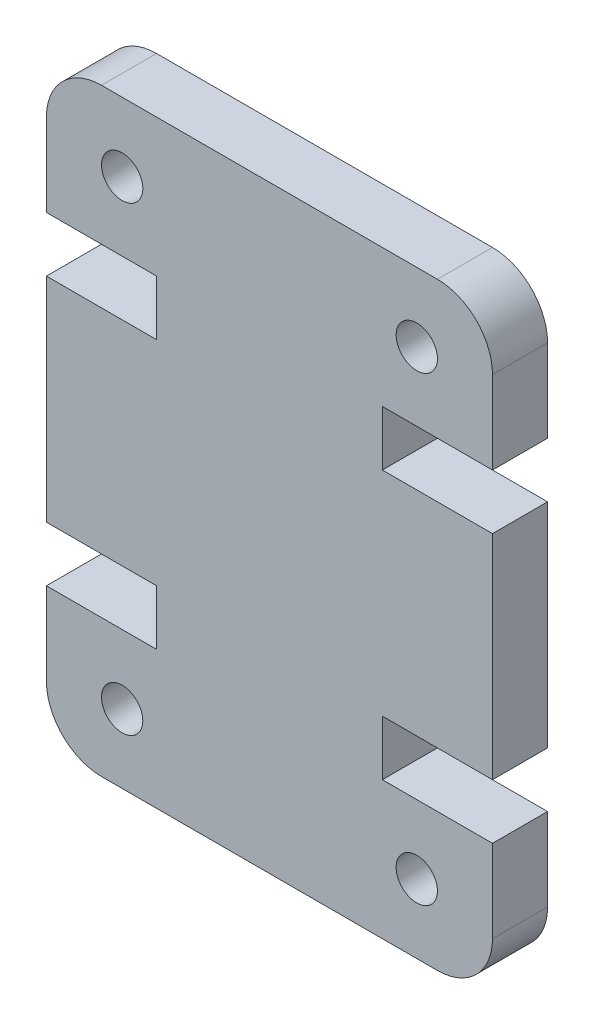
ISO-10303-21;
HEADER;
FILE_DESCRIPTION(('STEP AP214'),'2;1');
FILE_NAME('part.step','',(''),(''),'','','');
FILE_SCHEMA(('AUTOMOTIVE_DESIGN { 1 0 10303 214 1 1 1 1 }'));
ENDSEC;
DATA;
#1=APPLICATION_CONTEXT('core data for automotive mechanical design processes');
#2=APPLICATION_PROTOCOL_DEFINITION('international standard','automotive_design',2000,#1);
#3=PRODUCT_CONTEXT('',#1,'mechanical');
#4=PRODUCT('Part','Part','',(#3));
#5=PRODUCT_RELATED_PRODUCT_CATEGORY('part','',(#4));
#6=PRODUCT_DEFINITION_FORMATION('','',#4);
#7=PRODUCT_DEFINITION_CONTEXT('part definition',#1,'design');
#8=PRODUCT_DEFINITION('design','',#6,#7);
#9=PRODUCT_DEFINITION_SHAPE('','',#8);
#10=(LENGTH_UNIT() NAMED_UNIT(*) SI_UNIT(.MILLI.,.METRE.));
#11=(NAMED_UNIT(*) PLANE_ANGLE_UNIT() SI_UNIT($,.RADIAN.));
#12=(NAMED_UNIT(*) SI_UNIT($,.STERADIAN.) SOLID_ANGLE_UNIT());
#13=UNCERTAINTY_MEASURE_WITH_UNIT(LENGTH_MEASURE(1.E-05),#10,'distance_accuracy_value','');
#14=(GEOMETRIC_REPRESENTATION_CONTEXT(3) GLOBAL_UNCERTAINTY_ASSIGNED_CONTEXT((#13)) GLOBAL_UNIT_ASSIGNED_CONTEXT((#10,
#11,#12)) REPRESENTATION_CONTEXT('',''));
#15=CARTESIAN_POINT('',(0.,0.,0.));
#16=DIRECTION('',(0.,0.,1.));
#17=DIRECTION('',(1.,0.,0.));
#18=AXIS2_PLACEMENT_3D('',#15,#16,#17);
#19=CARTESIAN_POINT('',(14.2,2.,2.));
#20=DIRECTION('',(0.,0.,-1.));
#21=DIRECTION('',(-1.,0.,0.));
#22=AXIS2_PLACEMENT_3D('',#19,#20,#21);
#23=PLANE('',#22);
#24=CARTESIAN_POINT('',(2.75000000000004,19.2399999999998,2.));
#25=DIRECTION('',(0.,0.,1.));
#26=DIRECTION('',(-1.,0.,0.));
#27=AXIS2_PLACEMENT_3D('',#24,#25,#26);
#28=CIRCLE('',#27,0.75);
#29=CARTESIAN_POINT('',(2.00000000000004,19.2399999999998,2.));
#30=VERTEX_POINT('',#29);
#31=EDGE_CURVE('E448',#30,#30,#28,.T.);
#32=ORIENTED_EDGE('',*,*,#31,.F.);
#33=EDGE_LOOP('',(#32));
#34=FACE_BOUND('',#33,.T.);
#35=CARTESIAN_POINT('',(13.45,2.50000000000017,2.));
#36=DIRECTION('',(0.,0.,1.));
#37=DIRECTION('',(-1.,0.,0.));
#38=AXIS2_PLACEMENT_3D('',#35,#36,#37);
#39=CIRCLE('',#38,0.750000000000004);
#40=CARTESIAN_POINT('',(12.6999999999999,2.50000000000017,2.));
#41=VERTEX_POINT('',#40);
#42=EDGE_CURVE('E230',#41,#41,#39,.T.);
#43=ORIENTED_EDGE('',*,*,#42,.F.);
#44=EDGE_LOOP('',(#43));
#45=FACE_BOUND('',#44,.T.);
#46=CARTESIAN_POINT('',(14.2,2.,2.));
#47=DIRECTION('',(0.,0.,1.));
#48=DIRECTION('',(-1.,0.,0.));
#49=AXIS2_PLACEMENT_3D('',#46,#47,#48);
#50=CIRCLE('',#49,2.);
#51=CARTESIAN_POINT('',(14.2,0.,2.));
#52=VERTEX_POINT('',#51);
#53=CARTESIAN_POINT('',(16.2,2.,2.));
#54=VERTEX_POINT('',#53);
#55=EDGE_CURVE('E273',#52,#54,#50,.T.);
#56=ORIENTED_EDGE('',*,*,#55,.T.);
#57=DIRECTION('',(0.,1.,0.));
#58=VECTOR('',#57,1.);
#59=CARTESIAN_POINT('',(16.2,2.,2.));
#60=LINE('',#59,#58);
#61=CARTESIAN_POINT('',(16.2,4.99999999999945,2.));
#62=VERTEX_POINT('',#61);
#63=EDGE_CURVE('E141',#54,#62,#60,.T.);
#64=ORIENTED_EDGE('',*,*,#63,.T.);
#65=DIRECTION('',(-1.,0.,0.));
#66=VECTOR('',#65,1.);
#67=CARTESIAN_POINT('',(12.2,4.99999999999945,2.));
#68=LINE('',#67,#66);
#69=CARTESIAN_POINT('',(12.2,4.99999999999945,2.));
#70=VERTEX_POINT('',#69);
#71=EDGE_CURVE('E336',#62,#70,#68,.T.);
#72=ORIENTED_EDGE('',*,*,#71,.T.);
#73=DIRECTION('',(0.,1.,0.));
#74=VECTOR('',#73,1.);
#75=CARTESIAN_POINT('',(12.2,6.99999999999945,2.));
#76=LINE('',#75,#74);
#77=CARTESIAN_POINT('',(12.2,6.99999999999945,2.));
#78=VERTEX_POINT('',#77);
#79=EDGE_CURVE('E355',#70,#78,#76,.T.);
#80=ORIENTED_EDGE('',*,*,#79,.T.);
#81=DIRECTION('',(1.,0.,0.));
#82=VECTOR('',#81,1.);
#83=CARTESIAN_POINT('',(16.2,6.99999999999945,2.));
#84=LINE('',#83,#82);
#85=CARTESIAN_POINT('',(16.2,6.99999999999945,2.));
#86=VERTEX_POINT('',#85);
#87=EDGE_CURVE('E352',#78,#86,#84,.T.);
#88=ORIENTED_EDGE('',*,*,#87,.T.);
#89=DIRECTION('',(0.,1.,0.));
#90=VECTOR('',#89,1.);
#91=CARTESIAN_POINT('',(16.2,14.7400000000005,2.));
#92=LINE('',#91,#90);
#93=CARTESIAN_POINT('',(16.2,14.7400000000005,2.));
#94=VERTEX_POINT('',#93);
#95=EDGE_CURVE('E354',#86,#94,#92,.T.);
#96=ORIENTED_EDGE('',*,*,#95,.T.);
#97=DIRECTION('',(-1.,0.,0.));
#98=VECTOR('',#97,1.);
#99=CARTESIAN_POINT('',(16.2,14.7400000000005,2.));
#100=LINE('',#99,#98);
#101=CARTESIAN_POINT('',(12.2,14.7400000000005,2.));
#102=VERTEX_POINT('',#101);
#103=EDGE_CURVE('E357',#94,#102,#100,.T.);
#104=ORIENTED_EDGE('',*,*,#103,.T.);
#105=DIRECTION('',(0.,1.,0.));
#106=VECTOR('',#105,1.);
#107=CARTESIAN_POINT('',(12.2,14.7400000000005,2.));
#108=LINE('',#107,#106);
#109=CARTESIAN_POINT('',(12.2,16.7400000000005,2.));
#110=VERTEX_POINT('',#109);
#111=EDGE_CURVE('E363',#102,#110,#108,.T.);
#112=ORIENTED_EDGE('',*,*,#111,.T.);
#113=DIRECTION('',(1.,0.,0.));
#114=VECTOR('',#113,1.);
#115=CARTESIAN_POINT('',(12.2,16.7400000000005,2.));
#116=LINE('',#115,#114);
#117=CARTESIAN_POINT('',(16.2,16.7400000000005,2.));
#118=VERTEX_POINT('',#117);
#119=EDGE_CURVE('E365',#110,#118,#116,.T.);
#120=ORIENTED_EDGE('',*,*,#119,.T.);
#121=DIRECTION('',(0.,1.,0.));
#122=VECTOR('',#121,1.);
#123=CARTESIAN_POINT('',(16.2,19.74,2.));
#124=LINE('',#123,#122);
#125=CARTESIAN_POINT('',(16.2,19.74,2.));
#126=VERTEX_POINT('',#125);
#127=EDGE_CURVE('E367',#118,#126,#124,.T.);
#128=ORIENTED_EDGE('',*,*,#127,.T.);
#129=CARTESIAN_POINT('',(14.2,19.74,2.));
#130=DIRECTION('',(0.,0.,1.));
#131=DIRECTION('',(1.,0.,0.));
#132=AXIS2_PLACEMENT_3D('',#129,#130,#131);
#133=CIRCLE('',#132,2.);
#134=CARTESIAN_POINT('',(14.2,21.74,2.));
#135=VERTEX_POINT('',#134);
#136=EDGE_CURVE('E369',#126,#135,#133,.T.);
#137=ORIENTED_EDGE('',*,*,#136,.T.);
#138=DIRECTION('',(-1.,0.,0.));
#139=VECTOR('',#138,1.);
#140=CARTESIAN_POINT('',(1.99999999999999,21.74,2.));
#141=LINE('',#140,#139);
#142=CARTESIAN_POINT('',(1.99999999999999,21.74,2.));
#143=VERTEX_POINT('',#142);
#144=EDGE_CURVE('E371',#135,#143,#141,.T.);
#145=ORIENTED_EDGE('',*,*,#144,.T.);
#146=CARTESIAN_POINT('',(2.,19.74,2.));
#147=DIRECTION('',(0.,0.,1.));
#148=DIRECTION('',(-1.,0.,0.));
#149=AXIS2_PLACEMENT_3D('',#146,#147,#148);
#150=CIRCLE('',#149,2.);
#151=CARTESIAN_POINT('',(0.,19.74,2.));
#152=VERTEX_POINT('',#151);
#153=EDGE_CURVE('E373',#143,#152,#150,.T.);
#154=ORIENTED_EDGE('',*,*,#153,.T.);
#155=DIRECTION('',(0.,-1.,0.));
#156=VECTOR('',#155,1.);
#157=CARTESIAN_POINT('',(0.,19.74,2.));
#158=LINE('',#157,#156);
#159=CARTESIAN_POINT('',(0.,16.7400000000005,2.));
#160=VERTEX_POINT('',#159);
#161=EDGE_CURVE('E375',#152,#160,#158,.T.);
#162=ORIENTED_EDGE('',*,*,#161,.T.);
#163=DIRECTION('',(1.,0.,0.));
#164=VECTOR('',#163,1.);
#165=CARTESIAN_POINT('',(4.,16.7400000000005,2.));
#166=LINE('',#165,#164);
#167=CARTESIAN_POINT('',(4.,16.7400000000005,2.));
#168=VERTEX_POINT('',#167);
#169=EDGE_CURVE('E377',#160,#168,#166,.T.);
#170=ORIENTED_EDGE('',*,*,#169,.T.);
#171=DIRECTION('',(0.,-1.,0.));
#172=VECTOR('',#171,1.);
#173=CARTESIAN_POINT('',(4.,14.7400000000005,2.));
#174=LINE('',#173,#172);
#175=CARTESIAN_POINT('',(4.,14.7400000000005,2.));
#176=VERTEX_POINT('',#175);
#177=EDGE_CURVE('E379',#168,#176,#174,.T.);
#178=ORIENTED_EDGE('',*,*,#177,.T.);
#179=DIRECTION('',(-1.,0.,0.));
#180=VECTOR('',#179,1.);
#181=CARTESIAN_POINT('',(0.,14.7400000000005,2.));
#182=LINE('',#181,#180);
#183=CARTESIAN_POINT('',(0.,14.7400000000005,2.));
#184=VERTEX_POINT('',#183);
#185=EDGE_CURVE('E381',#176,#184,#182,.T.);
#186=ORIENTED_EDGE('',*,*,#185,.T.);
#187=DIRECTION('',(0.,-1.,0.));
#188=VECTOR('',#187,1.);
#189=CARTESIAN_POINT('',(0.,14.7400000000005,2.));
#190=LINE('',#189,#188);
#191=CARTESIAN_POINT('',(0.,6.99999999999946,2.));
#192=VERTEX_POINT('',#191);
#193=EDGE_CURVE('E383',#184,#192,#190,.T.);
#194=ORIENTED_EDGE('',*,*,#193,.T.);
#195=DIRECTION('',(1.,0.,0.));
#196=VECTOR('',#195,1.);
#197=CARTESIAN_POINT('',(0.,6.99999999999946,2.));
#198=LINE('',#197,#196);
#199=CARTESIAN_POINT('',(4.00000000000002,6.99999999999946,2.));
#200=VERTEX_POINT('',#199);
#201=EDGE_CURVE('E385',#192,#200,#198,.T.);
#202=ORIENTED_EDGE('',*,*,#201,.T.);
#203=DIRECTION('',(0.,-1.,0.));
#204=VECTOR('',#203,1.);
#205=CARTESIAN_POINT('',(4.00000000000002,6.99999999999946,2.));
#206=LINE('',#205,#204);
#207=CARTESIAN_POINT('',(4.,4.99999999999945,2.));
#208=VERTEX_POINT('',#207);
#209=EDGE_CURVE('E387',#200,#208,#206,.T.);
#210=ORIENTED_EDGE('',*,*,#209,.T.);
#211=DIRECTION('',(-1.,0.,0.));
#212=VECTOR('',#211,1.);
#213=CARTESIAN_POINT('',(4.,4.99999999999945,2.));
#214=LINE('',#213,#212);
#215=CARTESIAN_POINT('',(0.,4.99999999999945,2.));
#216=VERTEX_POINT('',#215);
#217=EDGE_CURVE('E208',#208,#216,#214,.T.);
#218=ORIENTED_EDGE('',*,*,#217,.T.);
#219=DIRECTION('',(0.,-1.,0.));
#220=VECTOR('',#219,1.);
#221=CARTESIAN_POINT('',(0.,2.,2.));
#222=LINE('',#221,#220);
#223=CARTESIAN_POINT('',(0.,2.,2.));
#224=VERTEX_POINT('',#223);
#225=EDGE_CURVE('E202',#216,#224,#222,.T.);
#226=ORIENTED_EDGE('',*,*,#225,.T.);
#227=CARTESIAN_POINT('',(2.00000000000002,2.,2.));
#228=DIRECTION('',(0.,0.,1.));
#229=DIRECTION('',(1.,0.,0.));
#230=AXIS2_PLACEMENT_3D('',#227,#228,#229);
#231=CIRCLE('',#230,2.00000000000001);
#232=CARTESIAN_POINT('',(2.00000000000002,0.,2.));
#233=VERTEX_POINT('',#232);
#234=EDGE_CURVE('E206',#224,#233,#231,.T.);
#235=ORIENTED_EDGE('',*,*,#234,.T.);
#236=DIRECTION('',(1.,0.,0.));
#237=VECTOR('',#236,1.);
#238=CARTESIAN_POINT('',(2.00000000000002,0.,2.));
#239=LINE('',#238,#237);
#240=EDGE_CURVE('E50',#233,#52,#239,.T.);
#241=ORIENTED_EDGE('',*,*,#240,.T.);
#242=EDGE_LOOP('',(#56,#64,#72,#80,#88,#96,#104,#112,#120,#128,#137,#145,#154,#162,#170,#178,
#186,#194,#202,#210,#218,#226,#235,#241));
#243=FACE_BOUND('',#242,.T.);
#244=CARTESIAN_POINT('',(2.75000000000004,2.50000000000017,2.));
#245=DIRECTION('',(0.,0.,1.));
#246=DIRECTION('',(1.,0.,0.));
#247=AXIS2_PLACEMENT_3D('',#244,#245,#246);
#248=CIRCLE('',#247,0.75);
#249=CARTESIAN_POINT('',(3.50000000000004,2.50000000000017,2.));
#250=VERTEX_POINT('',#249);
#251=EDGE_CURVE('E454',#250,#250,#248,.T.);
#252=ORIENTED_EDGE('',*,*,#251,.F.);
#253=EDGE_LOOP('',(#252));
#254=FACE_BOUND('',#253,.T.);
#255=CARTESIAN_POINT('',(13.45,19.2399999999998,2.));
#256=DIRECTION('',(0.,0.,1.));
#257=DIRECTION('',(1.,0.,0.));
#258=AXIS2_PLACEMENT_3D('',#255,#256,#257);
#259=CIRCLE('',#258,0.750000000000004);
#260=CARTESIAN_POINT('',(14.2,19.2399999999998,2.));
#261=VERTEX_POINT('',#260);
#262=EDGE_CURVE('E439',#261,#261,#259,.T.);
#263=ORIENTED_EDGE('',*,*,#262,.F.);
#264=EDGE_LOOP('',(#263));
#265=FACE_BOUND('',#264,.T.);
#266=ADVANCED_FACE('F33',(#34,#45,#243,#254,#265),#23,.F.);
#267=CARTESIAN_POINT('',(14.2,2.,0.));
#268=DIRECTION('',(0.,0.,-1.));
#269=DIRECTION('',(-1.,0.,0.));
#270=AXIS2_PLACEMENT_3D('',#267,#268,#269);
#271=PLANE('',#270);
#272=CARTESIAN_POINT('',(2.75000000000004,19.2399999999998,0.));
#273=DIRECTION('',(0.,0.,1.));
#274=DIRECTION('',(-1.,0.,0.));
#275=AXIS2_PLACEMENT_3D('',#272,#273,#274);
#276=CIRCLE('',#275,0.75);
#277=CARTESIAN_POINT('',(2.00000000000004,19.2399999999998,0.));
#278=VERTEX_POINT('',#277);
#279=EDGE_CURVE('E445',#278,#278,#276,.T.);
#280=ORIENTED_EDGE('',*,*,#279,.T.);
#281=EDGE_LOOP('',(#280));
#282=FACE_BOUND('',#281,.T.);
#283=CARTESIAN_POINT('',(13.45,2.50000000000017,0.));
#284=DIRECTION('',(0.,0.,1.));
#285=DIRECTION('',(-1.,0.,0.));
#286=AXIS2_PLACEMENT_3D('',#283,#284,#285);
#287=CIRCLE('',#286,0.750000000000004);
#288=CARTESIAN_POINT('',(12.6999999999999,2.50000000000017,0.));
#289=VERTEX_POINT('',#288);
#290=EDGE_CURVE('E457',#289,#289,#287,.T.);
#291=ORIENTED_EDGE('',*,*,#290,.T.);
#292=EDGE_LOOP('',(#291));
#293=FACE_BOUND('',#292,.T.);
#294=CARTESIAN_POINT('',(14.2,2.,0.));
#295=DIRECTION('',(0.,0.,1.));
#296=DIRECTION('',(-1.,0.,0.));
#297=AXIS2_PLACEMENT_3D('',#294,#295,#296);
#298=CIRCLE('',#297,2.);
#299=CARTESIAN_POINT('',(14.2,0.,0.));
#300=VERTEX_POINT('',#299);
#301=CARTESIAN_POINT('',(16.2,2.,0.));
#302=VERTEX_POINT('',#301);
#303=EDGE_CURVE('E226',#300,#302,#298,.T.);
#304=ORIENTED_EDGE('',*,*,#303,.F.);
#305=DIRECTION('',(1.,0.,0.));
#306=VECTOR('',#305,1.);
#307=CARTESIAN_POINT('',(2.00000000000002,0.,0.));
#308=LINE('',#307,#306);
#309=CARTESIAN_POINT('',(2.00000000000002,0.,0.));
#310=VERTEX_POINT('',#309);
#311=EDGE_CURVE('E133',#310,#300,#308,.T.);
#312=ORIENTED_EDGE('',*,*,#311,.F.);
#313=CARTESIAN_POINT('',(2.00000000000002,2.,0.));
#314=DIRECTION('',(0.,0.,1.));
#315=DIRECTION('',(1.,0.,0.));
#316=AXIS2_PLACEMENT_3D('',#313,#314,#315);
#317=CIRCLE('',#316,2.00000000000001);
#318=CARTESIAN_POINT('',(0.,2.,0.));
#319=VERTEX_POINT('',#318);
#320=EDGE_CURVE('E127',#319,#310,#317,.T.);
#321=ORIENTED_EDGE('',*,*,#320,.F.);
#322=DIRECTION('',(0.,-1.,0.));
#323=VECTOR('',#322,1.);
#324=CARTESIAN_POINT('',(0.,2.,0.));
#325=LINE('',#324,#323);
#326=CARTESIAN_POINT('',(0.,4.99999999999945,0.));
#327=VERTEX_POINT('',#326);
#328=EDGE_CURVE('E216',#327,#319,#325,.T.);
#329=ORIENTED_EDGE('',*,*,#328,.F.);
#330=DIRECTION('',(-1.,0.,0.));
#331=VECTOR('',#330,1.);
#332=CARTESIAN_POINT('',(4.,4.99999999999945,0.));
#333=LINE('',#332,#331);
#334=CARTESIAN_POINT('',(4.,4.99999999999945,0.));
#335=VERTEX_POINT('',#334);
#336=EDGE_CURVE('E268',#335,#327,#333,.T.);
#337=ORIENTED_EDGE('',*,*,#336,.F.);
#338=DIRECTION('',(0.,-1.,0.));
#339=VECTOR('',#338,1.);
#340=CARTESIAN_POINT('',(4.00000000000002,6.99999999999946,0.));
#341=LINE('',#340,#339);
#342=CARTESIAN_POINT('',(4.00000000000002,6.99999999999946,0.));
#343=VERTEX_POINT('',#342);
#344=EDGE_CURVE('E266',#343,#335,#341,.T.);
#345=ORIENTED_EDGE('',*,*,#344,.F.);
#346=DIRECTION('',(1.,0.,0.));
#347=VECTOR('',#346,1.);
#348=CARTESIAN_POINT('',(0.,6.99999999999946,0.));
#349=LINE('',#348,#347);
#350=CARTESIAN_POINT('',(0.,6.99999999999946,0.));
#351=VERTEX_POINT('',#350);
#352=EDGE_CURVE('E264',#351,#343,#349,.T.);
#353=ORIENTED_EDGE('',*,*,#352,.F.);
#354=DIRECTION('',(0.,-1.,0.));
#355=VECTOR('',#354,1.);
#356=CARTESIAN_POINT('',(0.,14.7400000000005,0.));
#357=LINE('',#356,#355);
#358=CARTESIAN_POINT('',(0.,14.7400000000005,0.));
#359=VERTEX_POINT('',#358);
#360=EDGE_CURVE('E262',#359,#351,#357,.T.);
#361=ORIENTED_EDGE('',*,*,#360,.F.);
#362=DIRECTION('',(-1.,0.,0.));
#363=VECTOR('',#362,1.);
#364=CARTESIAN_POINT('',(0.,14.7400000000005,0.));
#365=LINE('',#364,#363);
#366=CARTESIAN_POINT('',(4.,14.7400000000005,0.));
#367=VERTEX_POINT('',#366);
#368=EDGE_CURVE('E260',#367,#359,#365,.T.);
#369=ORIENTED_EDGE('',*,*,#368,.F.);
#370=DIRECTION('',(0.,-1.,0.));
#371=VECTOR('',#370,1.);
#372=CARTESIAN_POINT('',(4.,14.7400000000005,0.));
#373=LINE('',#372,#371);
#374=CARTESIAN_POINT('',(4.,16.7400000000005,0.));
#375=VERTEX_POINT('',#374);
#376=EDGE_CURVE('E258',#375,#367,#373,.T.);
#377=ORIENTED_EDGE('',*,*,#376,.F.);
#378=DIRECTION('',(1.,0.,0.));
#379=VECTOR('',#378,1.);
#380=CARTESIAN_POINT('',(4.,16.7400000000005,0.));
#381=LINE('',#380,#379);
#382=CARTESIAN_POINT('',(0.,16.7400000000005,0.));
#383=VERTEX_POINT('',#382);
#384=EDGE_CURVE('E256',#383,#375,#381,.T.);
#385=ORIENTED_EDGE('',*,*,#384,.F.);
#386=DIRECTION('',(0.,-1.,0.));
#387=VECTOR('',#386,1.);
#388=CARTESIAN_POINT('',(0.,19.74,0.));
#389=LINE('',#388,#387);
#390=CARTESIAN_POINT('',(0.,19.74,0.));
#391=VERTEX_POINT('',#390);
#392=EDGE_CURVE('E254',#391,#383,#389,.T.);
#393=ORIENTED_EDGE('',*,*,#392,.F.);
#394=CARTESIAN_POINT('',(2.,19.74,0.));
#395=DIRECTION('',(0.,0.,1.));
#396=DIRECTION('',(-1.,0.,0.));
#397=AXIS2_PLACEMENT_3D('',#394,#395,#396);
#398=CIRCLE('',#397,2.);
#399=CARTESIAN_POINT('',(1.99999999999999,21.74,0.));
#400=VERTEX_POINT('',#399);
#401=EDGE_CURVE('E252',#400,#391,#398,.T.);
#402=ORIENTED_EDGE('',*,*,#401,.F.);
#403=DIRECTION('',(-1.,0.,0.));
#404=VECTOR('',#403,1.);
#405=CARTESIAN_POINT('',(1.99999999999999,21.74,0.));
#406=LINE('',#405,#404);
#407=CARTESIAN_POINT('',(14.2,21.74,0.));
#408=VERTEX_POINT('',#407);
#409=EDGE_CURVE('E250',#408,#400,#406,.T.);
#410=ORIENTED_EDGE('',*,*,#409,.F.);
#411=CARTESIAN_POINT('',(14.2,19.74,0.));
#412=DIRECTION('',(0.,0.,1.));
#413=DIRECTION('',(1.,0.,0.));
#414=AXIS2_PLACEMENT_3D('',#411,#412,#413);
#415=CIRCLE('',#414,2.);
#416=CARTESIAN_POINT('',(16.2,19.74,0.));
#417=VERTEX_POINT('',#416);
#418=EDGE_CURVE('E248',#417,#408,#415,.T.);
#419=ORIENTED_EDGE('',*,*,#418,.F.);
#420=DIRECTION('',(0.,1.,0.));
#421=VECTOR('',#420,1.);
#422=CARTESIAN_POINT('',(16.2,19.74,0.));
#423=LINE('',#422,#421);
#424=CARTESIAN_POINT('',(16.2,16.7400000000005,0.));
#425=VERTEX_POINT('',#424);
#426=EDGE_CURVE('E246',#425,#417,#423,.T.);
#427=ORIENTED_EDGE('',*,*,#426,.F.);
#428=DIRECTION('',(1.,0.,0.));
#429=VECTOR('',#428,1.);
#430=CARTESIAN_POINT('',(12.2,16.7400000000005,0.));
#431=LINE('',#430,#429);
#432=CARTESIAN_POINT('',(12.2,16.7400000000005,0.));
#433=VERTEX_POINT('',#432);
#434=EDGE_CURVE('E244',#433,#425,#431,.T.);
#435=ORIENTED_EDGE('',*,*,#434,.F.);
#436=DIRECTION('',(0.,1.,0.));
#437=VECTOR('',#436,1.);
#438=CARTESIAN_POINT('',(12.2,14.7400000000005,0.));
#439=LINE('',#438,#437);
#440=CARTESIAN_POINT('',(12.2,14.7400000000005,0.));
#441=VERTEX_POINT('',#440);
#442=EDGE_CURVE('E242',#441,#433,#439,.T.);
#443=ORIENTED_EDGE('',*,*,#442,.F.);
#444=DIRECTION('',(-1.,0.,0.));
#445=VECTOR('',#444,1.);
#446=CARTESIAN_POINT('',(16.2,14.7400000000005,0.));
#447=LINE('',#446,#445);
#448=CARTESIAN_POINT('',(16.2,14.7400000000005,0.));
#449=VERTEX_POINT('',#448);
#450=EDGE_CURVE('E240',#449,#441,#447,.T.);
#451=ORIENTED_EDGE('',*,*,#450,.F.);
#452=DIRECTION('',(0.,1.,0.));
#453=VECTOR('',#452,1.);
#454=CARTESIAN_POINT('',(16.2,14.7400000000005,0.));
#455=LINE('',#454,#453);
#456=CARTESIAN_POINT('',(16.2,6.99999999999945,0.));
#457=VERTEX_POINT('',#456);
#458=EDGE_CURVE('E238',#457,#449,#455,.T.);
#459=ORIENTED_EDGE('',*,*,#458,.F.);
#460=DIRECTION('',(1.,0.,0.));
#461=VECTOR('',#460,1.);
#462=CARTESIAN_POINT('',(16.2,6.99999999999945,0.));
#463=LINE('',#462,#461);
#464=CARTESIAN_POINT('',(12.2,6.99999999999945,0.));
#465=VERTEX_POINT('',#464);
#466=EDGE_CURVE('E236',#465,#457,#463,.T.);
#467=ORIENTED_EDGE('',*,*,#466,.F.);
#468=DIRECTION('',(0.,1.,0.));
#469=VECTOR('',#468,1.);
#470=CARTESIAN_POINT('',(12.2,6.99999999999945,0.));
#471=LINE('',#470,#469);
#472=CARTESIAN_POINT('',(12.2,4.99999999999945,0.));
#473=VERTEX_POINT('',#472);
#474=EDGE_CURVE('E234',#473,#465,#471,.T.);
#475=ORIENTED_EDGE('',*,*,#474,.F.);
#476=DIRECTION('',(-1.,0.,0.));
#477=VECTOR('',#476,1.);
#478=CARTESIAN_POINT('',(12.2,4.99999999999945,0.));
#479=LINE('',#478,#477);
#480=CARTESIAN_POINT('',(16.2,4.99999999999945,0.));
#481=VERTEX_POINT('',#480);
#482=EDGE_CURVE('E232',#481,#473,#479,.T.);
#483=ORIENTED_EDGE('',*,*,#482,.F.);
#484=DIRECTION('',(0.,1.,0.));
#485=VECTOR('',#484,1.);
#486=CARTESIAN_POINT('',(16.2,2.,0.));
#487=LINE('',#486,#485);
#488=EDGE_CURVE('E229',#302,#481,#487,.T.);
#489=ORIENTED_EDGE('',*,*,#488,.F.);
#490=EDGE_LOOP('',(#304,#312,#321,#329,#337,#345,#353,#361,#369,#377,#385,#393,#402,#410,#419,
#427,#435,#443,#451,#459,#467,#475,#483,#489));
#491=FACE_BOUND('',#490,.T.);
#492=CARTESIAN_POINT('',(2.75000000000004,2.50000000000017,0.));
#493=DIRECTION('',(0.,0.,1.));
#494=DIRECTION('',(1.,0.,0.));
#495=AXIS2_PLACEMENT_3D('',#492,#493,#494);
#496=CIRCLE('',#495,0.75);
#497=CARTESIAN_POINT('',(3.50000000000004,2.50000000000017,0.));
#498=VERTEX_POINT('',#497);
#499=EDGE_CURVE('E451',#498,#498,#496,.T.);
#500=ORIENTED_EDGE('',*,*,#499,.T.);
#501=EDGE_LOOP('',(#500));
#502=FACE_BOUND('',#501,.T.);
#503=CARTESIAN_POINT('',(13.45,19.2399999999998,0.));
#504=DIRECTION('',(0.,0.,1.));
#505=DIRECTION('',(1.,0.,0.));
#506=AXIS2_PLACEMENT_3D('',#503,#504,#505);
#507=CIRCLE('',#506,0.750000000000004);
#508=CARTESIAN_POINT('',(14.2,19.2399999999998,0.));
#509=VERTEX_POINT('',#508);
#510=EDGE_CURVE('E442',#509,#509,#507,.T.);
#511=ORIENTED_EDGE('',*,*,#510,.T.);
#512=EDGE_LOOP('',(#511));
#513=FACE_BOUND('',#512,.T.);
#514=ADVANCED_FACE('F340',(#282,#293,#491,#502,#513),#271,.T.);
#515=CARTESIAN_POINT('',(14.2,2.,2.));
#516=DIRECTION('',(0.,0.,-1.));
#517=DIRECTION('',(-1.,0.,0.));
#518=AXIS2_PLACEMENT_3D('',#515,#516,#517);
#519=CYLINDRICAL_SURFACE('',#518,2.);
#520=ORIENTED_EDGE('',*,*,#303,.T.);
#521=DIRECTION('',(0.,0.,-1.));
#522=VECTOR('',#521,1.);
#523=CARTESIAN_POINT('',(16.2,2.,2.));
#524=LINE('',#523,#522);
#525=EDGE_CURVE('E11',#54,#302,#524,.T.);
#526=ORIENTED_EDGE('',*,*,#525,.F.);
#527=ORIENTED_EDGE('',*,*,#55,.F.);
#528=DIRECTION('',(0.,0.,-1.));
#529=VECTOR('',#528,1.);
#530=CARTESIAN_POINT('',(14.2,0.,2.));
#531=LINE('',#530,#529);
#532=EDGE_CURVE('E222',#52,#300,#531,.T.);
#533=ORIENTED_EDGE('',*,*,#532,.T.);
#534=EDGE_LOOP('',(#520,#526,#527,#533));
#535=FACE_BOUND('',#534,.T.);
#536=ADVANCED_FACE('F35',(#535),#519,.T.);
#537=CARTESIAN_POINT('',(16.2,2.,2.));
#538=DIRECTION('',(-1.,0.,0.));
#539=DIRECTION('',(0.,-1.,0.));
#540=AXIS2_PLACEMENT_3D('',#537,#538,#539);
#541=PLANE('',#540);
#542=ORIENTED_EDGE('',*,*,#488,.T.);
#543=DIRECTION('',(0.,0.,-1.));
#544=VECTOR('',#543,1.);
#545=CARTESIAN_POINT('',(16.2,4.99999999999945,2.));
#546=LINE('',#545,#544);
#547=EDGE_CURVE('E42',#62,#481,#546,.T.);
#548=ORIENTED_EDGE('',*,*,#547,.F.);
#549=ORIENTED_EDGE('',*,*,#63,.F.);
#550=ORIENTED_EDGE('',*,*,#525,.T.);
#551=EDGE_LOOP('',(#542,#548,#549,#550));
#552=FACE_BOUND('',#551,.T.);
#553=ADVANCED_FACE('F686',(#552),#541,.F.);
#554=CARTESIAN_POINT('',(12.2,4.99999999999945,2.));
#555=DIRECTION('',(0.,-1.,0.));
#556=DIRECTION('',(0.,0.,-1.));
#557=AXIS2_PLACEMENT_3D('',#554,#555,#556);
#558=PLANE('',#557);
#559=ORIENTED_EDGE('',*,*,#482,.T.);
#560=DIRECTION('',(0.,0.,-1.));
#561=VECTOR('',#560,1.);
#562=CARTESIAN_POINT('',(12.2,4.99999999999945,2.));
#563=LINE('',#562,#561);
#564=EDGE_CURVE('E328',#70,#473,#563,.T.);
#565=ORIENTED_EDGE('',*,*,#564,.F.);
#566=ORIENTED_EDGE('',*,*,#71,.F.);
#567=ORIENTED_EDGE('',*,*,#547,.T.);
#568=EDGE_LOOP('',(#559,#565,#566,#567));
#569=FACE_BOUND('',#568,.T.);
#570=ADVANCED_FACE('F334',(#569),#558,.F.);
#571=CARTESIAN_POINT('',(12.2,6.99999999999945,2.));
#572=DIRECTION('',(-1.,0.,0.));
#573=DIRECTION('',(0.,0.,1.));
#574=AXIS2_PLACEMENT_3D('',#571,#572,#573);
#575=PLANE('',#574);
#576=ORIENTED_EDGE('',*,*,#474,.T.);
#577=DIRECTION('',(0.,0.,-1.));
#578=VECTOR('',#577,1.);
#579=CARTESIAN_POINT('',(12.2,6.99999999999945,2.));
#580=LINE('',#579,#578);
#581=EDGE_CURVE('E325',#78,#465,#580,.T.);
#582=ORIENTED_EDGE('',*,*,#581,.F.);
#583=ORIENTED_EDGE('',*,*,#79,.F.);
#584=ORIENTED_EDGE('',*,*,#564,.T.);
#585=EDGE_LOOP('',(#576,#582,#583,#584));
#586=FACE_BOUND('',#585,.T.);
#587=ADVANCED_FACE('F346',(#586),#575,.F.);
#588=CARTESIAN_POINT('',(16.2,6.99999999999945,2.));
#589=DIRECTION('',(0.,1.,0.));
#590=DIRECTION('',(-1.,0.,0.));
#591=AXIS2_PLACEMENT_3D('',#588,#589,#590);
#592=PLANE('',#591);
#593=ORIENTED_EDGE('',*,*,#466,.T.);
#594=DIRECTION('',(0.,0.,-1.));
#595=VECTOR('',#594,1.);
#596=CARTESIAN_POINT('',(16.2,6.99999999999945,2.));
#597=LINE('',#596,#595);
#598=EDGE_CURVE('E322',#86,#457,#597,.T.);
#599=ORIENTED_EDGE('',*,*,#598,.F.);
#600=ORIENTED_EDGE('',*,*,#87,.F.);
#601=ORIENTED_EDGE('',*,*,#581,.T.);
#602=EDGE_LOOP('',(#593,#599,#600,#601));
#603=FACE_BOUND('',#602,.T.);
#604=ADVANCED_FACE('F350',(#603),#592,.F.);
#605=CARTESIAN_POINT('',(16.2,14.7400000000005,2.));
#606=DIRECTION('',(-1.,0.,0.));
#607=DIRECTION('',(0.,0.,1.));
#608=AXIS2_PLACEMENT_3D('',#605,#606,#607);
#609=PLANE('',#608);
#610=ORIENTED_EDGE('',*,*,#458,.T.);
#611=DIRECTION('',(0.,0.,-1.));
#612=VECTOR('',#611,1.);
#613=CARTESIAN_POINT('',(16.2,14.7400000000005,2.));
#614=LINE('',#613,#612);
#615=EDGE_CURVE('E319',#94,#449,#614,.T.);
#616=ORIENTED_EDGE('',*,*,#615,.F.);
#617=ORIENTED_EDGE('',*,*,#95,.F.);
#618=ORIENTED_EDGE('',*,*,#598,.T.);
#619=EDGE_LOOP('',(#610,#616,#617,#618));
#620=FACE_BOUND('',#619,.T.);
#621=ADVANCED_FACE('F651',(#620),#609,.F.);
#622=CARTESIAN_POINT('',(16.2,14.7400000000005,2.));
#623=DIRECTION('',(0.,-1.,0.));
#624=DIRECTION('',(1.,0.,0.));
#625=AXIS2_PLACEMENT_3D('',#622,#623,#624);
#626=PLANE('',#625);
#627=ORIENTED_EDGE('',*,*,#450,.T.);
#628=DIRECTION('',(0.,0.,-1.));
#629=VECTOR('',#628,1.);
#630=CARTESIAN_POINT('',(12.2,14.7400000000005,2.));
#631=LINE('',#630,#629);
#632=EDGE_CURVE('E316',#102,#441,#631,.T.);
#633=ORIENTED_EDGE('',*,*,#632,.F.);
#634=ORIENTED_EDGE('',*,*,#103,.F.);
#635=ORIENTED_EDGE('',*,*,#615,.T.);
#636=EDGE_LOOP('',(#627,#633,#634,#635));
#637=FACE_BOUND('',#636,.T.);
#638=ADVANCED_FACE('F641',(#637),#626,.F.);
#639=CARTESIAN_POINT('',(12.2,14.7400000000005,2.));
#640=DIRECTION('',(-1.,0.,0.));
#641=DIRECTION('',(0.,0.,1.));
#642=AXIS2_PLACEMENT_3D('',#639,#640,#641);
#643=PLANE('',#642);
#644=ORIENTED_EDGE('',*,*,#442,.T.);
#645=DIRECTION('',(0.,0.,-1.));
#646=VECTOR('',#645,1.);
#647=CARTESIAN_POINT('',(12.2,16.7400000000005,2.));
#648=LINE('',#647,#646);
#649=EDGE_CURVE('E313',#110,#433,#648,.T.);
#650=ORIENTED_EDGE('',*,*,#649,.F.);
#651=ORIENTED_EDGE('',*,*,#111,.F.);
#652=ORIENTED_EDGE('',*,*,#632,.T.);
#653=EDGE_LOOP('',(#644,#650,#651,#652));
#654=FACE_BOUND('',#653,.T.);
#655=ADVANCED_FACE('F631',(#654),#643,.F.);
#656=CARTESIAN_POINT('',(12.2,16.7400000000005,2.));
#657=DIRECTION('',(0.,1.,0.));
#658=DIRECTION('',(0.,0.,1.));
#659=AXIS2_PLACEMENT_3D('',#656,#657,#658);
#660=PLANE('',#659);
#661=ORIENTED_EDGE('',*,*,#434,.T.);
#662=DIRECTION('',(0.,0.,-1.));
#663=VECTOR('',#662,1.);
#664=CARTESIAN_POINT('',(16.2,16.7400000000005,2.));
#665=LINE('',#664,#663);
#666=EDGE_CURVE('E310',#118,#425,#665,.T.);
#667=ORIENTED_EDGE('',*,*,#666,.F.);
#668=ORIENTED_EDGE('',*,*,#119,.F.);
#669=ORIENTED_EDGE('',*,*,#649,.T.);
#670=EDGE_LOOP('',(#661,#667,#668,#669));
#671=FACE_BOUND('',#670,.T.);
#672=ADVANCED_FACE('F621',(#671),#660,.F.);
#673=CARTESIAN_POINT('',(16.2,19.74,2.));
#674=DIRECTION('',(-1.,0.,0.));
#675=DIRECTION('',(0.,-1.,0.));
#676=AXIS2_PLACEMENT_3D('',#673,#674,#675);
#677=PLANE('',#676);
#678=ORIENTED_EDGE('',*,*,#426,.T.);
#679=DIRECTION('',(0.,0.,-1.));
#680=VECTOR('',#679,1.);
#681=CARTESIAN_POINT('',(16.2,19.74,2.));
#682=LINE('',#681,#680);
#683=EDGE_CURVE('E307',#126,#417,#682,.T.);
#684=ORIENTED_EDGE('',*,*,#683,.F.);
#685=ORIENTED_EDGE('',*,*,#127,.F.);
#686=ORIENTED_EDGE('',*,*,#666,.T.);
#687=EDGE_LOOP('',(#678,#684,#685,#686));
#688=FACE_BOUND('',#687,.T.);
#689=ADVANCED_FACE('F611',(#688),#677,.F.);
#690=CARTESIAN_POINT('',(14.2,19.74,2.));
#691=DIRECTION('',(0.,0.,-1.));
#692=DIRECTION('',(-1.,0.,0.));
#693=AXIS2_PLACEMENT_3D('',#690,#691,#692);
#694=CYLINDRICAL_SURFACE('',#693,2.);
#695=ORIENTED_EDGE('',*,*,#418,.T.);
#696=DIRECTION('',(0.,0.,-1.));
#697=VECTOR('',#696,1.);
#698=CARTESIAN_POINT('',(14.2,21.74,2.));
#699=LINE('',#698,#697);
#700=EDGE_CURVE('E304',#135,#408,#699,.T.);
#701=ORIENTED_EDGE('',*,*,#700,.F.);
#702=ORIENTED_EDGE('',*,*,#136,.F.);
#703=ORIENTED_EDGE('',*,*,#683,.T.);
#704=EDGE_LOOP('',(#695,#701,#702,#703));
#705=FACE_BOUND('',#704,.T.);
#706=ADVANCED_FACE('F601',(#705),#694,.T.);
#707=CARTESIAN_POINT('',(1.99999999999999,21.74,2.));
#708=DIRECTION('',(0.,-1.,0.));
#709=DIRECTION('',(0.,0.,-1.));
#710=AXIS2_PLACEMENT_3D('',#707,#708,#709);
#711=PLANE('',#710);
#712=ORIENTED_EDGE('',*,*,#409,.T.);
#713=DIRECTION('',(0.,0.,-1.));
#714=VECTOR('',#713,1.);
#715=CARTESIAN_POINT('',(1.99999999999999,21.74,2.));
#716=LINE('',#715,#714);
#717=EDGE_CURVE('E301',#143,#400,#716,.T.);
#718=ORIENTED_EDGE('',*,*,#717,.F.);
#719=ORIENTED_EDGE('',*,*,#144,.F.);
#720=ORIENTED_EDGE('',*,*,#700,.T.);
#721=EDGE_LOOP('',(#712,#718,#719,#720));
#722=FACE_BOUND('',#721,.T.);
#723=ADVANCED_FACE('F591',(#722),#711,.F.);
#724=CARTESIAN_POINT('',(2.,19.74,2.));
#725=DIRECTION('',(0.,0.,-1.));
#726=DIRECTION('',(-1.,0.,0.));
#727=AXIS2_PLACEMENT_3D('',#724,#725,#726);
#728=CYLINDRICAL_SURFACE('',#727,2.);
#729=ORIENTED_EDGE('',*,*,#401,.T.);
#730=DIRECTION('',(0.,0.,-1.));
#731=VECTOR('',#730,1.);
#732=CARTESIAN_POINT('',(0.,19.74,2.));
#733=LINE('',#732,#731);
#734=EDGE_CURVE('E298',#152,#391,#733,.T.);
#735=ORIENTED_EDGE('',*,*,#734,.F.);
#736=ORIENTED_EDGE('',*,*,#153,.F.);
#737=ORIENTED_EDGE('',*,*,#717,.T.);
#738=EDGE_LOOP('',(#729,#735,#736,#737));
#739=FACE_BOUND('',#738,.T.);
#740=ADVANCED_FACE('F581',(#739),#728,.T.);
#741=CARTESIAN_POINT('',(0.,19.74,2.));
#742=DIRECTION('',(1.,0.,0.));
#743=DIRECTION('',(0.,1.,0.));
#744=AXIS2_PLACEMENT_3D('',#741,#742,#743);
#745=PLANE('',#744);
#746=ORIENTED_EDGE('',*,*,#392,.T.);
#747=DIRECTION('',(0.,0.,-1.));
#748=VECTOR('',#747,1.);
#749=CARTESIAN_POINT('',(0.,16.7400000000005,2.));
#750=LINE('',#749,#748);
#751=EDGE_CURVE('E295',#160,#383,#750,.T.);
#752=ORIENTED_EDGE('',*,*,#751,.F.);
#753=ORIENTED_EDGE('',*,*,#161,.F.);
#754=ORIENTED_EDGE('',*,*,#734,.T.);
#755=EDGE_LOOP('',(#746,#752,#753,#754));
#756=FACE_BOUND('',#755,.T.);
#757=ADVANCED_FACE('F571',(#756),#745,.F.);
#758=CARTESIAN_POINT('',(4.,16.7400000000005,2.));
#759=DIRECTION('',(0.,1.,0.));
#760=DIRECTION('',(-1.,0.,0.));
#761=AXIS2_PLACEMENT_3D('',#758,#759,#760);
#762=PLANE('',#761);
#763=ORIENTED_EDGE('',*,*,#384,.T.);
#764=DIRECTION('',(0.,0.,-1.));
#765=VECTOR('',#764,1.);
#766=CARTESIAN_POINT('',(4.,16.7400000000005,2.));
#767=LINE('',#766,#765);
#768=EDGE_CURVE('E292',#168,#375,#767,.T.);
#769=ORIENTED_EDGE('',*,*,#768,.F.);
#770=ORIENTED_EDGE('',*,*,#169,.F.);
#771=ORIENTED_EDGE('',*,*,#751,.T.);
#772=EDGE_LOOP('',(#763,#769,#770,#771));
#773=FACE_BOUND('',#772,.T.);
#774=ADVANCED_FACE('F561',(#773),#762,.F.);
#775=CARTESIAN_POINT('',(4.,14.7400000000005,2.));
#776=DIRECTION('',(1.,0.,0.));
#777=DIRECTION('',(0.,0.,-1.));
#778=AXIS2_PLACEMENT_3D('',#775,#776,#777);
#779=PLANE('',#778);
#780=ORIENTED_EDGE('',*,*,#376,.T.);
#781=DIRECTION('',(0.,0.,-1.));
#782=VECTOR('',#781,1.);
#783=CARTESIAN_POINT('',(4.,14.7400000000005,2.));
#784=LINE('',#783,#782);
#785=EDGE_CURVE('E289',#176,#367,#784,.T.);
#786=ORIENTED_EDGE('',*,*,#785,.F.);
#787=ORIENTED_EDGE('',*,*,#177,.F.);
#788=ORIENTED_EDGE('',*,*,#768,.T.);
#789=EDGE_LOOP('',(#780,#786,#787,#788));
#790=FACE_BOUND('',#789,.T.);
#791=ADVANCED_FACE('F551',(#790),#779,.F.);
#792=CARTESIAN_POINT('',(0.,14.7400000000005,2.));
#793=DIRECTION('',(0.,-1.,0.));
#794=DIRECTION('',(1.,0.,0.));
#795=AXIS2_PLACEMENT_3D('',#792,#793,#794);
#796=PLANE('',#795);
#797=ORIENTED_EDGE('',*,*,#368,.T.);
#798=DIRECTION('',(0.,0.,-1.));
#799=VECTOR('',#798,1.);
#800=CARTESIAN_POINT('',(0.,14.7400000000005,2.));
#801=LINE('',#800,#799);
#802=EDGE_CURVE('E286',#184,#359,#801,.T.);
#803=ORIENTED_EDGE('',*,*,#802,.F.);
#804=ORIENTED_EDGE('',*,*,#185,.F.);
#805=ORIENTED_EDGE('',*,*,#785,.T.);
#806=EDGE_LOOP('',(#797,#803,#804,#805));
#807=FACE_BOUND('',#806,.T.);
#808=ADVANCED_FACE('F541',(#807),#796,.F.);
#809=CARTESIAN_POINT('',(0.,14.7400000000005,2.));
#810=DIRECTION('',(1.,0.,0.));
#811=DIRECTION('',(0.,1.,0.));
#812=AXIS2_PLACEMENT_3D('',#809,#810,#811);
#813=PLANE('',#812);
#814=ORIENTED_EDGE('',*,*,#360,.T.);
#815=DIRECTION('',(0.,0.,-1.));
#816=VECTOR('',#815,1.);
#817=CARTESIAN_POINT('',(0.,6.99999999999946,2.));
#818=LINE('',#817,#816);
#819=EDGE_CURVE('E283',#192,#351,#818,.T.);
#820=ORIENTED_EDGE('',*,*,#819,.F.);
#821=ORIENTED_EDGE('',*,*,#193,.F.);
#822=ORIENTED_EDGE('',*,*,#802,.T.);
#823=EDGE_LOOP('',(#814,#820,#821,#822));
#824=FACE_BOUND('',#823,.T.);
#825=ADVANCED_FACE('F531',(#824),#813,.F.);
#826=CARTESIAN_POINT('',(0.,6.99999999999946,2.));
#827=DIRECTION('',(0.,1.,0.));
#828=DIRECTION('',(0.,0.,1.));
#829=AXIS2_PLACEMENT_3D('',#826,#827,#828);
#830=PLANE('',#829);
#831=ORIENTED_EDGE('',*,*,#352,.T.);
#832=DIRECTION('',(0.,0.,-1.));
#833=VECTOR('',#832,1.);
#834=CARTESIAN_POINT('',(4.00000000000002,6.99999999999946,2.));
#835=LINE('',#834,#833);
#836=EDGE_CURVE('E280',#200,#343,#835,.T.);
#837=ORIENTED_EDGE('',*,*,#836,.F.);
#838=ORIENTED_EDGE('',*,*,#201,.F.);
#839=ORIENTED_EDGE('',*,*,#819,.T.);
#840=EDGE_LOOP('',(#831,#837,#838,#839));
#841=FACE_BOUND('',#840,.T.);
#842=ADVANCED_FACE('F522',(#841),#830,.F.);
#843=CARTESIAN_POINT('',(4.00000000000002,6.99999999999946,2.));
#844=DIRECTION('',(1.,0.,0.));
#845=DIRECTION('',(0.,1.,0.));
#846=AXIS2_PLACEMENT_3D('',#843,#844,#845);
#847=PLANE('',#846);
#848=ORIENTED_EDGE('',*,*,#344,.T.);
#849=DIRECTION('',(0.,0.,-1.));
#850=VECTOR('',#849,1.);
#851=CARTESIAN_POINT('',(4.,4.99999999999945,2.));
#852=LINE('',#851,#850);
#853=EDGE_CURVE('E277',#208,#335,#852,.T.);
#854=ORIENTED_EDGE('',*,*,#853,.F.);
#855=ORIENTED_EDGE('',*,*,#209,.F.);
#856=ORIENTED_EDGE('',*,*,#836,.T.);
#857=EDGE_LOOP('',(#848,#854,#855,#856));
#858=FACE_BOUND('',#857,.T.);
#859=ADVANCED_FACE('F393',(#858),#847,.F.);
#860=CARTESIAN_POINT('',(4.,4.99999999999945,2.));
#861=DIRECTION('',(0.,-1.,0.));
#862=DIRECTION('',(0.,0.,-1.));
#863=AXIS2_PLACEMENT_3D('',#860,#861,#862);
#864=PLANE('',#863);
#865=ORIENTED_EDGE('',*,*,#336,.T.);
#866=DIRECTION('',(0.,0.,-1.));
#867=VECTOR('',#866,1.);
#868=CARTESIAN_POINT('',(0.,4.99999999999945,2.));
#869=LINE('',#868,#867);
#870=EDGE_CURVE('E217',#216,#327,#869,.T.);
#871=ORIENTED_EDGE('',*,*,#870,.F.);
#872=ORIENTED_EDGE('',*,*,#217,.F.);
#873=ORIENTED_EDGE('',*,*,#853,.T.);
#874=EDGE_LOOP('',(#865,#871,#872,#873));
#875=FACE_BOUND('',#874,.T.);
#876=ADVANCED_FACE('F397',(#875),#864,.F.);
#877=CARTESIAN_POINT('',(0.,2.,2.));
#878=DIRECTION('',(1.,0.,0.));
#879=DIRECTION('',(0.,0.,-1.));
#880=AXIS2_PLACEMENT_3D('',#877,#878,#879);
#881=PLANE('',#880);
#882=ORIENTED_EDGE('',*,*,#328,.T.);
#883=DIRECTION('',(0.,0.,-1.));
#884=VECTOR('',#883,1.);
#885=CARTESIAN_POINT('',(0.,2.,2.));
#886=LINE('',#885,#884);
#887=EDGE_CURVE('E213',#224,#319,#886,.T.);
#888=ORIENTED_EDGE('',*,*,#887,.F.);
#889=ORIENTED_EDGE('',*,*,#225,.F.);
#890=ORIENTED_EDGE('',*,*,#870,.T.);
#891=EDGE_LOOP('',(#882,#888,#889,#890));
#892=FACE_BOUND('',#891,.T.);
#893=ADVANCED_FACE('F214',(#892),#881,.F.);
#894=CARTESIAN_POINT('',(2.00000000000002,2.,2.));
#895=DIRECTION('',(0.,0.,-1.));
#896=DIRECTION('',(-1.,0.,0.));
#897=AXIS2_PLACEMENT_3D('',#894,#895,#896);
#898=CYLINDRICAL_SURFACE('',#897,2.00000000000001);
#899=ORIENTED_EDGE('',*,*,#320,.T.);
#900=DIRECTION('',(0.,0.,-1.));
#901=VECTOR('',#900,1.);
#902=CARTESIAN_POINT('',(2.00000000000002,0.,2.));
#903=LINE('',#902,#901);
#904=EDGE_CURVE('E218',#233,#310,#903,.T.);
#905=ORIENTED_EDGE('',*,*,#904,.F.);
#906=ORIENTED_EDGE('',*,*,#234,.F.);
#907=ORIENTED_EDGE('',*,*,#887,.T.);
#908=EDGE_LOOP('',(#899,#905,#906,#907));
#909=FACE_BOUND('',#908,.T.);
#910=ADVANCED_FACE('F220',(#909),#898,.T.);
#911=CARTESIAN_POINT('',(2.00000000000002,0.,2.));
#912=DIRECTION('',(0.,1.,0.));
#913=DIRECTION('',(-1.,0.,0.));
#914=AXIS2_PLACEMENT_3D('',#911,#912,#913);
#915=PLANE('',#914);
#916=ORIENTED_EDGE('',*,*,#311,.T.);
#917=ORIENTED_EDGE('',*,*,#532,.F.);
#918=ORIENTED_EDGE('',*,*,#240,.F.);
#919=ORIENTED_EDGE('',*,*,#904,.T.);
#920=EDGE_LOOP('',(#916,#917,#918,#919));
#921=FACE_BOUND('',#920,.T.);
#922=ADVANCED_FACE('F401',(#921),#915,.F.);
#923=CARTESIAN_POINT('',(13.45,2.50000000000017,2.));
#924=DIRECTION('',(0.,0.,-1.));
#925=DIRECTION('',(-1.,0.,0.));
#926=AXIS2_PLACEMENT_3D('',#923,#924,#925);
#927=CYLINDRICAL_SURFACE('',#926,0.750000000000004);
#928=ORIENTED_EDGE('',*,*,#42,.T.);
#929=EDGE_LOOP('',(#928));
#930=FACE_BOUND('',#929,.T.);
#931=ORIENTED_EDGE('',*,*,#290,.F.);
#932=EDGE_LOOP('',(#931));
#933=FACE_BOUND('',#932,.T.);
#934=ADVANCED_FACE('F403',(#930,#933),#927,.F.);
#935=CARTESIAN_POINT('',(2.75000000000004,2.50000000000017,2.));
#936=DIRECTION('',(0.,0.,-1.));
#937=DIRECTION('',(-1.,0.,0.));
#938=AXIS2_PLACEMENT_3D('',#935,#936,#937);
#939=CYLINDRICAL_SURFACE('',#938,0.75);
#940=ORIENTED_EDGE('',*,*,#251,.T.);
#941=EDGE_LOOP('',(#940));
#942=FACE_BOUND('',#941,.T.);
#943=ORIENTED_EDGE('',*,*,#499,.F.);
#944=EDGE_LOOP('',(#943));
#945=FACE_BOUND('',#944,.T.);
#946=ADVANCED_FACE('F409',(#942,#945),#939,.F.);
#947=CARTESIAN_POINT('',(2.75000000000004,19.2399999999998,2.));
#948=DIRECTION('',(0.,0.,-1.));
#949=DIRECTION('',(-1.,0.,0.));
#950=AXIS2_PLACEMENT_3D('',#947,#948,#949);
#951=CYLINDRICAL_SURFACE('',#950,0.75);
#952=ORIENTED_EDGE('',*,*,#31,.T.);
#953=EDGE_LOOP('',(#952));
#954=FACE_BOUND('',#953,.T.);
#955=ORIENTED_EDGE('',*,*,#279,.F.);
#956=EDGE_LOOP('',(#955));
#957=FACE_BOUND('',#956,.T.);
#958=ADVANCED_FACE('F426',(#954,#957),#951,.F.);
#959=CARTESIAN_POINT('',(13.45,19.2399999999998,2.));
#960=DIRECTION('',(0.,0.,-1.));
#961=DIRECTION('',(-1.,0.,0.));
#962=AXIS2_PLACEMENT_3D('',#959,#960,#961);
#963=CYLINDRICAL_SURFACE('',#962,0.750000000000004);
#964=ORIENTED_EDGE('',*,*,#262,.T.);
#965=EDGE_LOOP('',(#964));
#966=FACE_BOUND('',#965,.T.);
#967=ORIENTED_EDGE('',*,*,#510,.F.);
#968=EDGE_LOOP('',(#967));
#969=FACE_BOUND('',#968,.T.);
#970=ADVANCED_FACE('F430',(#966,#969),#963,.F.);
#971=CLOSED_SHELL('',(#266,#514,#536,#553,#570,#587,#604,#621,#638,#655,#672,#689,#706,#723,
#740,#757,#774,#791,#808,#825,#842,#859,#876,#893,#910,#922,#934,#946,#958,#970));
#972=MANIFOLD_SOLID_BREP('B2',#971);
#973=ADVANCED_BREP_SHAPE_REPRESENTATION('',(#18,#972),#14);
#974=SHAPE_DEFINITION_REPRESENTATION(#9,#973);
ENDSEC;
END-ISO-10303-21;
